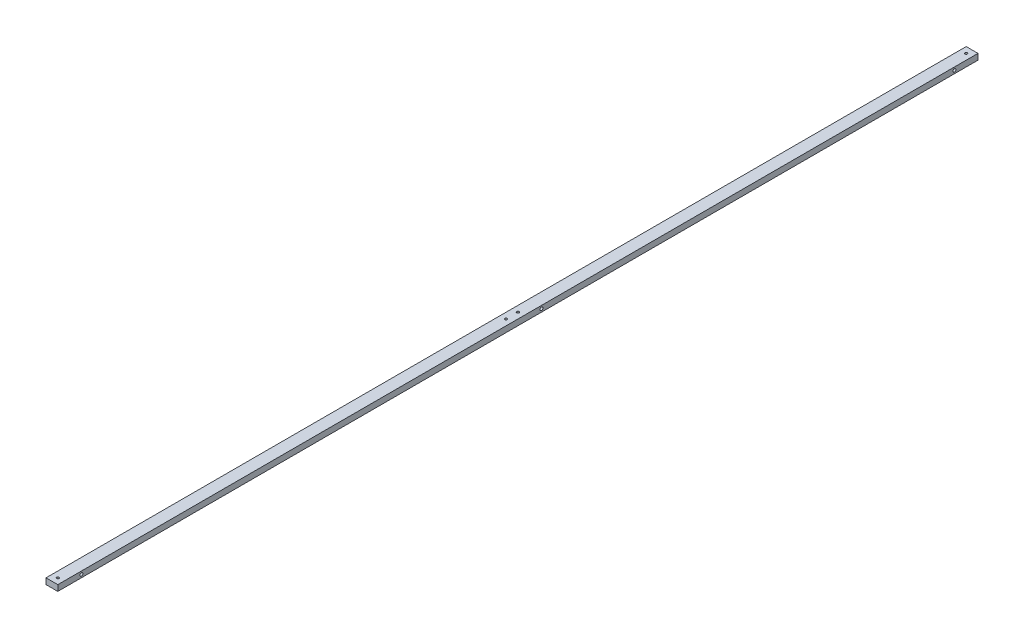
ISO-10303-21;
HEADER;
FILE_DESCRIPTION(('STEP AP214'),'2;1');
FILE_NAME('part.step','',(''),(''),'','','');
FILE_SCHEMA(('AUTOMOTIVE_DESIGN { 1 0 10303 214 1 1 1 1 }'));
ENDSEC;
DATA;
#1=APPLICATION_CONTEXT('core data for automotive mechanical design processes');
#2=APPLICATION_PROTOCOL_DEFINITION('international standard','automotive_design',2000,#1);
#3=PRODUCT_CONTEXT('',#1,'mechanical');
#4=PRODUCT('Part','Part','',(#3));
#5=PRODUCT_RELATED_PRODUCT_CATEGORY('part','',(#4));
#6=PRODUCT_DEFINITION_FORMATION('','',#4);
#7=PRODUCT_DEFINITION_CONTEXT('part definition',#1,'design');
#8=PRODUCT_DEFINITION('design','',#6,#7);
#9=PRODUCT_DEFINITION_SHAPE('','',#8);
#10=(LENGTH_UNIT() NAMED_UNIT(*) SI_UNIT(.MILLI.,.METRE.));
#11=(NAMED_UNIT(*) PLANE_ANGLE_UNIT() SI_UNIT($,.RADIAN.));
#12=(NAMED_UNIT(*) SI_UNIT($,.STERADIAN.) SOLID_ANGLE_UNIT());
#13=UNCERTAINTY_MEASURE_WITH_UNIT(LENGTH_MEASURE(1.E-05),#10,'distance_accuracy_value','');
#14=(GEOMETRIC_REPRESENTATION_CONTEXT(3) GLOBAL_UNCERTAINTY_ASSIGNED_CONTEXT((#13)) GLOBAL_UNIT_ASSIGNED_CONTEXT((#10,
#11,#12)) REPRESENTATION_CONTEXT('',''));
#15=CARTESIAN_POINT('',(0.,0.,0.));
#16=DIRECTION('',(0.,0.,1.));
#17=DIRECTION('',(1.,0.,0.));
#18=AXIS2_PLACEMENT_3D('',#15,#16,#17);
#19=CARTESIAN_POINT('',(0.,0.,1981.2));
#20=DIRECTION('',(1.,0.,0.));
#21=DIRECTION('',(0.,0.,-1.));
#22=AXIS2_PLACEMENT_3D('',#19,#20,#21);
#23=PLANE('',#22);
#24=CARTESIAN_POINT('',(0.,6.35,50.8));
#25=DIRECTION('',(1.,0.,0.));
#26=DIRECTION('',(0.,0.,-1.));
#27=AXIS2_PLACEMENT_3D('',#24,#25,#26);
#28=CIRCLE('',#27,3.175);
#29=CARTESIAN_POINT('',(0.,6.35,47.625));
#30=VERTEX_POINT('',#29);
#31=EDGE_CURVE('E148',#30,#30,#28,.T.);
#32=ORIENTED_EDGE('',*,*,#31,.T.);
#33=EDGE_LOOP('',(#32));
#34=FACE_BOUND('',#33,.T.);
#35=CARTESIAN_POINT('',(0.,6.35,939.8));
#36=DIRECTION('',(1.,0.,0.));
#37=DIRECTION('',(0.,0.,-1.));
#38=AXIS2_PLACEMENT_3D('',#35,#36,#37);
#39=CIRCLE('',#38,3.175);
#40=CARTESIAN_POINT('',(0.,6.35,936.625));
#41=VERTEX_POINT('',#40);
#42=EDGE_CURVE('E142',#41,#41,#39,.T.);
#43=ORIENTED_EDGE('',*,*,#42,.T.);
#44=EDGE_LOOP('',(#43));
#45=FACE_BOUND('',#44,.T.);
#46=CARTESIAN_POINT('',(0.,6.35,1930.4));
#47=DIRECTION('',(1.,0.,0.));
#48=DIRECTION('',(0.,0.,-1.));
#49=AXIS2_PLACEMENT_3D('',#46,#47,#48);
#50=CIRCLE('',#49,3.175);
#51=CARTESIAN_POINT('',(0.,6.35,1927.225));
#52=VERTEX_POINT('',#51);
#53=EDGE_CURVE('E136',#52,#52,#50,.T.);
#54=ORIENTED_EDGE('',*,*,#53,.T.);
#55=EDGE_LOOP('',(#54));
#56=FACE_BOUND('',#55,.T.);
#57=DIRECTION('',(0.,-1.,0.));
#58=VECTOR('',#57,1.);
#59=CARTESIAN_POINT('',(0.,0.,0.));
#60=LINE('',#59,#58);
#61=CARTESIAN_POINT('',(0.,12.7,0.));
#62=VERTEX_POINT('',#61);
#63=CARTESIAN_POINT('',(0.,0.,0.));
#64=VERTEX_POINT('',#63);
#65=EDGE_CURVE('E99',#62,#64,#60,.T.);
#66=ORIENTED_EDGE('',*,*,#65,.T.);
#67=DIRECTION('',(0.,0.,-1.));
#68=VECTOR('',#67,1.);
#69=CARTESIAN_POINT('',(0.,0.,1981.2));
#70=LINE('',#69,#68);
#71=CARTESIAN_POINT('',(0.,0.,1981.2));
#72=VERTEX_POINT('',#71);
#73=EDGE_CURVE('E11',#72,#64,#70,.T.);
#74=ORIENTED_EDGE('',*,*,#73,.F.);
#75=DIRECTION('',(0.,-1.,0.));
#76=VECTOR('',#75,1.);
#77=CARTESIAN_POINT('',(0.,0.,1981.2));
#78=LINE('',#77,#76);
#79=CARTESIAN_POINT('',(0.,12.7,1981.2));
#80=VERTEX_POINT('',#79);
#81=EDGE_CURVE('E87',#80,#72,#78,.T.);
#82=ORIENTED_EDGE('',*,*,#81,.F.);
#83=DIRECTION('',(0.,0.,-1.));
#84=VECTOR('',#83,1.);
#85=CARTESIAN_POINT('',(0.,12.7,1981.2));
#86=LINE('',#85,#84);
#87=EDGE_CURVE('E95',#80,#62,#86,.T.);
#88=ORIENTED_EDGE('',*,*,#87,.T.);
#89=EDGE_LOOP('',(#66,#74,#82,#88));
#90=FACE_BOUND('',#89,.T.);
#91=ADVANCED_FACE('F36',(#34,#45,#56,#90),#23,.F.);
#92=CARTESIAN_POINT('',(0.,0.,1981.2));
#93=DIRECTION('',(0.,1.,0.));
#94=DIRECTION('',(0.,0.,1.));
#95=AXIS2_PLACEMENT_3D('',#92,#93,#94);
#96=PLANE('',#95);
#97=CARTESIAN_POINT('',(12.7,0.,1968.5));
#98=DIRECTION('',(0.,1.,0.));
#99=DIRECTION('',(0.,0.,1.));
#100=AXIS2_PLACEMENT_3D('',#97,#98,#99);
#101=CIRCLE('',#100,2.5527);
#102=CARTESIAN_POINT('',(12.7,0.,1971.0527));
#103=VERTEX_POINT('',#102);
#104=EDGE_CURVE('E130',#103,#103,#101,.T.);
#105=ORIENTED_EDGE('',*,*,#104,.T.);
#106=EDGE_LOOP('',(#105));
#107=FACE_BOUND('',#106,.T.);
#108=CARTESIAN_POINT('',(12.7,0.,977.9));
#109=DIRECTION('',(0.,1.,0.));
#110=DIRECTION('',(0.,0.,1.));
#111=AXIS2_PLACEMENT_3D('',#108,#109,#110);
#112=CIRCLE('',#111,2.5527);
#113=CARTESIAN_POINT('',(12.7,0.,980.4527));
#114=VERTEX_POINT('',#113);
#115=EDGE_CURVE('E124',#114,#114,#112,.T.);
#116=ORIENTED_EDGE('',*,*,#115,.T.);
#117=EDGE_LOOP('',(#116));
#118=FACE_BOUND('',#117,.T.);
#119=CARTESIAN_POINT('',(12.7,0.,1003.3));
#120=DIRECTION('',(0.,1.,0.));
#121=DIRECTION('',(0.,0.,1.));
#122=AXIS2_PLACEMENT_3D('',#119,#120,#121);
#123=CIRCLE('',#122,2.5527);
#124=CARTESIAN_POINT('',(12.7,0.,1005.8527));
#125=VERTEX_POINT('',#124);
#126=EDGE_CURVE('E118',#125,#125,#123,.T.);
#127=ORIENTED_EDGE('',*,*,#126,.T.);
#128=EDGE_LOOP('',(#127));
#129=FACE_BOUND('',#128,.T.);
#130=CARTESIAN_POINT('',(12.7,0.,12.6999999999999));
#131=DIRECTION('',(0.,1.,0.));
#132=DIRECTION('',(0.,0.,1.));
#133=AXIS2_PLACEMENT_3D('',#130,#131,#132);
#134=CIRCLE('',#133,2.5527);
#135=CARTESIAN_POINT('',(12.7,0.,15.2526999999999));
#136=VERTEX_POINT('',#135);
#137=EDGE_CURVE('E102',#136,#136,#134,.T.);
#138=ORIENTED_EDGE('',*,*,#137,.T.);
#139=EDGE_LOOP('',(#138));
#140=FACE_BOUND('',#139,.T.);
#141=DIRECTION('',(1.,0.,0.));
#142=VECTOR('',#141,1.);
#143=CARTESIAN_POINT('',(0.,0.,0.));
#144=LINE('',#143,#142);
#145=CARTESIAN_POINT('',(25.4,0.,0.));
#146=VERTEX_POINT('',#145);
#147=EDGE_CURVE('E91',#64,#146,#144,.T.);
#148=ORIENTED_EDGE('',*,*,#147,.T.);
#149=DIRECTION('',(0.,0.,-1.));
#150=VECTOR('',#149,1.);
#151=CARTESIAN_POINT('',(25.4,0.,1981.2));
#152=LINE('',#151,#150);
#153=CARTESIAN_POINT('',(25.4,0.,1981.2));
#154=VERTEX_POINT('',#153);
#155=EDGE_CURVE('E44',#154,#146,#152,.T.);
#156=ORIENTED_EDGE('',*,*,#155,.F.);
#157=DIRECTION('',(1.,0.,0.));
#158=VECTOR('',#157,1.);
#159=CARTESIAN_POINT('',(0.,0.,1981.2));
#160=LINE('',#159,#158);
#161=EDGE_CURVE('E82',#72,#154,#160,.T.);
#162=ORIENTED_EDGE('',*,*,#161,.F.);
#163=ORIENTED_EDGE('',*,*,#73,.T.);
#164=EDGE_LOOP('',(#148,#156,#162,#163));
#165=FACE_BOUND('',#164,.T.);
#166=ADVANCED_FACE('F90',(#107,#118,#129,#140,#165),#96,.F.);
#167=CARTESIAN_POINT('',(25.4,0.,1981.2));
#168=DIRECTION('',(-1.,0.,0.));
#169=DIRECTION('',(0.,0.,1.));
#170=AXIS2_PLACEMENT_3D('',#167,#168,#169);
#171=PLANE('',#170);
#172=CARTESIAN_POINT('',(25.4,6.35,50.8));
#173=DIRECTION('',(1.,0.,0.));
#174=DIRECTION('',(0.,0.,-1.));
#175=AXIS2_PLACEMENT_3D('',#172,#173,#174);
#176=CIRCLE('',#175,3.175);
#177=CARTESIAN_POINT('',(25.4,6.35,47.625));
#178=VERTEX_POINT('',#177);
#179=EDGE_CURVE('E151',#178,#178,#176,.T.);
#180=ORIENTED_EDGE('',*,*,#179,.F.);
#181=EDGE_LOOP('',(#180));
#182=FACE_BOUND('',#181,.T.);
#183=CARTESIAN_POINT('',(25.4,6.35,939.8));
#184=DIRECTION('',(1.,0.,0.));
#185=DIRECTION('',(0.,0.,-1.));
#186=AXIS2_PLACEMENT_3D('',#183,#184,#185);
#187=CIRCLE('',#186,3.175);
#188=CARTESIAN_POINT('',(25.4,6.35,936.625));
#189=VERTEX_POINT('',#188);
#190=EDGE_CURVE('E145',#189,#189,#187,.T.);
#191=ORIENTED_EDGE('',*,*,#190,.F.);
#192=EDGE_LOOP('',(#191));
#193=FACE_BOUND('',#192,.T.);
#194=CARTESIAN_POINT('',(25.4,6.35,1930.4));
#195=DIRECTION('',(1.,0.,0.));
#196=DIRECTION('',(0.,0.,-1.));
#197=AXIS2_PLACEMENT_3D('',#194,#195,#196);
#198=CIRCLE('',#197,3.175);
#199=CARTESIAN_POINT('',(25.4,6.35,1927.225));
#200=VERTEX_POINT('',#199);
#201=EDGE_CURVE('E139',#200,#200,#198,.T.);
#202=ORIENTED_EDGE('',*,*,#201,.F.);
#203=EDGE_LOOP('',(#202));
#204=FACE_BOUND('',#203,.T.);
#205=DIRECTION('',(0.,1.,0.));
#206=VECTOR('',#205,1.);
#207=CARTESIAN_POINT('',(25.4,0.,0.));
#208=LINE('',#207,#206);
#209=CARTESIAN_POINT('',(25.4,12.7,0.));
#210=VERTEX_POINT('',#209);
#211=EDGE_CURVE('E69',#146,#210,#208,.T.);
#212=ORIENTED_EDGE('',*,*,#211,.T.);
#213=DIRECTION('',(0.,0.,-1.));
#214=VECTOR('',#213,1.);
#215=CARTESIAN_POINT('',(25.4,12.7,1981.2));
#216=LINE('',#215,#214);
#217=CARTESIAN_POINT('',(25.4,12.7,1981.2));
#218=VERTEX_POINT('',#217);
#219=EDGE_CURVE('E92',#218,#210,#216,.T.);
#220=ORIENTED_EDGE('',*,*,#219,.F.);
#221=DIRECTION('',(0.,1.,0.));
#222=VECTOR('',#221,1.);
#223=CARTESIAN_POINT('',(25.4,0.,1981.2));
#224=LINE('',#223,#222);
#225=EDGE_CURVE('E85',#154,#218,#224,.T.);
#226=ORIENTED_EDGE('',*,*,#225,.F.);
#227=ORIENTED_EDGE('',*,*,#155,.T.);
#228=EDGE_LOOP('',(#212,#220,#226,#227));
#229=FACE_BOUND('',#228,.T.);
#230=ADVANCED_FACE('F93',(#182,#193,#204,#229),#171,.F.);
#231=CARTESIAN_POINT('',(0.,12.7,1981.2));
#232=DIRECTION('',(0.,-1.,0.));
#233=DIRECTION('',(0.,0.,-1.));
#234=AXIS2_PLACEMENT_3D('',#231,#232,#233);
#235=PLANE('',#234);
#236=CARTESIAN_POINT('',(12.7,12.7,1968.5));
#237=DIRECTION('',(0.,1.,0.));
#238=DIRECTION('',(0.,0.,1.));
#239=AXIS2_PLACEMENT_3D('',#236,#237,#238);
#240=CIRCLE('',#239,2.5527);
#241=CARTESIAN_POINT('',(12.7,12.7,1971.0527));
#242=VERTEX_POINT('',#241);
#243=EDGE_CURVE('E133',#242,#242,#240,.T.);
#244=ORIENTED_EDGE('',*,*,#243,.F.);
#245=EDGE_LOOP('',(#244));
#246=FACE_BOUND('',#245,.T.);
#247=CARTESIAN_POINT('',(12.7,12.7,977.9));
#248=DIRECTION('',(0.,1.,0.));
#249=DIRECTION('',(0.,0.,1.));
#250=AXIS2_PLACEMENT_3D('',#247,#248,#249);
#251=CIRCLE('',#250,2.5527);
#252=CARTESIAN_POINT('',(12.7,12.7,980.4527));
#253=VERTEX_POINT('',#252);
#254=EDGE_CURVE('E127',#253,#253,#251,.T.);
#255=ORIENTED_EDGE('',*,*,#254,.F.);
#256=EDGE_LOOP('',(#255));
#257=FACE_BOUND('',#256,.T.);
#258=CARTESIAN_POINT('',(12.7,12.7,1003.3));
#259=DIRECTION('',(0.,1.,0.));
#260=DIRECTION('',(0.,0.,1.));
#261=AXIS2_PLACEMENT_3D('',#258,#259,#260);
#262=CIRCLE('',#261,2.5527);
#263=CARTESIAN_POINT('',(12.7,12.7,1005.8527));
#264=VERTEX_POINT('',#263);
#265=EDGE_CURVE('E121',#264,#264,#262,.T.);
#266=ORIENTED_EDGE('',*,*,#265,.F.);
#267=EDGE_LOOP('',(#266));
#268=FACE_BOUND('',#267,.T.);
#269=CARTESIAN_POINT('',(12.7,12.7,12.6999999999999));
#270=DIRECTION('',(0.,1.,0.));
#271=DIRECTION('',(0.,0.,1.));
#272=AXIS2_PLACEMENT_3D('',#269,#270,#271);
#273=CIRCLE('',#272,2.5527);
#274=CARTESIAN_POINT('',(12.7,12.7,15.2526999999999));
#275=VERTEX_POINT('',#274);
#276=EDGE_CURVE('E115',#275,#275,#273,.T.);
#277=ORIENTED_EDGE('',*,*,#276,.F.);
#278=EDGE_LOOP('',(#277));
#279=FACE_BOUND('',#278,.T.);
#280=DIRECTION('',(-1.,0.,0.));
#281=VECTOR('',#280,1.);
#282=CARTESIAN_POINT('',(0.,12.7,0.));
#283=LINE('',#282,#281);
#284=EDGE_CURVE('E75',#210,#62,#283,.T.);
#285=ORIENTED_EDGE('',*,*,#284,.T.);
#286=ORIENTED_EDGE('',*,*,#87,.F.);
#287=DIRECTION('',(-1.,0.,0.));
#288=VECTOR('',#287,1.);
#289=CARTESIAN_POINT('',(0.,12.7,1981.2));
#290=LINE('',#289,#288);
#291=EDGE_CURVE('E52',#218,#80,#290,.T.);
#292=ORIENTED_EDGE('',*,*,#291,.F.);
#293=ORIENTED_EDGE('',*,*,#219,.T.);
#294=EDGE_LOOP('',(#285,#286,#292,#293));
#295=FACE_BOUND('',#294,.T.);
#296=ADVANCED_FACE('F107',(#246,#257,#268,#279,#295),#235,.F.);
#297=CARTESIAN_POINT('',(0.,0.,1981.2));
#298=DIRECTION('',(0.,0.,-1.));
#299=DIRECTION('',(-1.,0.,0.));
#300=AXIS2_PLACEMENT_3D('',#297,#298,#299);
#301=PLANE('',#300);
#302=ORIENTED_EDGE('',*,*,#81,.T.);
#303=ORIENTED_EDGE('',*,*,#161,.T.);
#304=ORIENTED_EDGE('',*,*,#225,.T.);
#305=ORIENTED_EDGE('',*,*,#291,.T.);
#306=EDGE_LOOP('',(#302,#303,#304,#305));
#307=FACE_BOUND('',#306,.T.);
#308=ADVANCED_FACE('F83',(#307),#301,.F.);
#309=CARTESIAN_POINT('',(0.,0.,0.));
#310=DIRECTION('',(0.,0.,-1.));
#311=DIRECTION('',(-1.,0.,0.));
#312=AXIS2_PLACEMENT_3D('',#309,#310,#311);
#313=PLANE('',#312);
#314=ORIENTED_EDGE('',*,*,#65,.F.);
#315=ORIENTED_EDGE('',*,*,#284,.F.);
#316=ORIENTED_EDGE('',*,*,#211,.F.);
#317=ORIENTED_EDGE('',*,*,#147,.F.);
#318=EDGE_LOOP('',(#314,#315,#316,#317));
#319=FACE_BOUND('',#318,.T.);
#320=ADVANCED_FACE('F110',(#319),#313,.T.);
#321=CARTESIAN_POINT('',(12.7,12.7,12.6999999999999));
#322=DIRECTION('',(0.,1.,0.));
#323=DIRECTION('',(0.,0.,1.));
#324=AXIS2_PLACEMENT_3D('',#321,#322,#323);
#325=CYLINDRICAL_SURFACE('',#324,2.5527);
#326=ORIENTED_EDGE('',*,*,#137,.F.);
#327=EDGE_LOOP('',(#326));
#328=FACE_BOUND('',#327,.T.);
#329=ORIENTED_EDGE('',*,*,#276,.T.);
#330=EDGE_LOOP('',(#329));
#331=FACE_BOUND('',#330,.T.);
#332=ADVANCED_FACE('F242',(#328,#331),#325,.F.);
#333=CARTESIAN_POINT('',(12.7,12.7,1003.3));
#334=DIRECTION('',(0.,1.,0.));
#335=DIRECTION('',(0.,0.,1.));
#336=AXIS2_PLACEMENT_3D('',#333,#334,#335);
#337=CYLINDRICAL_SURFACE('',#336,2.5527);
#338=ORIENTED_EDGE('',*,*,#126,.F.);
#339=EDGE_LOOP('',(#338));
#340=FACE_BOUND('',#339,.T.);
#341=ORIENTED_EDGE('',*,*,#265,.T.);
#342=EDGE_LOOP('',(#341));
#343=FACE_BOUND('',#342,.T.);
#344=ADVANCED_FACE('F232',(#340,#343),#337,.F.);
#345=CARTESIAN_POINT('',(12.7,12.7,977.9));
#346=DIRECTION('',(0.,1.,0.));
#347=DIRECTION('',(0.,0.,1.));
#348=AXIS2_PLACEMENT_3D('',#345,#346,#347);
#349=CYLINDRICAL_SURFACE('',#348,2.5527);
#350=ORIENTED_EDGE('',*,*,#115,.F.);
#351=EDGE_LOOP('',(#350));
#352=FACE_BOUND('',#351,.T.);
#353=ORIENTED_EDGE('',*,*,#254,.T.);
#354=EDGE_LOOP('',(#353));
#355=FACE_BOUND('',#354,.T.);
#356=ADVANCED_FACE('F176',(#352,#355),#349,.F.);
#357=CARTESIAN_POINT('',(12.7,12.7,1968.5));
#358=DIRECTION('',(0.,1.,0.));
#359=DIRECTION('',(0.,0.,1.));
#360=AXIS2_PLACEMENT_3D('',#357,#358,#359);
#361=CYLINDRICAL_SURFACE('',#360,2.5527);
#362=ORIENTED_EDGE('',*,*,#104,.F.);
#363=EDGE_LOOP('',(#362));
#364=FACE_BOUND('',#363,.T.);
#365=ORIENTED_EDGE('',*,*,#243,.T.);
#366=EDGE_LOOP('',(#365));
#367=FACE_BOUND('',#366,.T.);
#368=ADVANCED_FACE('F167',(#364,#367),#361,.F.);
#369=CARTESIAN_POINT('',(25.4,6.35,1930.4));
#370=DIRECTION('',(1.,0.,0.));
#371=DIRECTION('',(0.,0.,-1.));
#372=AXIS2_PLACEMENT_3D('',#369,#370,#371);
#373=CYLINDRICAL_SURFACE('',#372,3.175);
#374=ORIENTED_EDGE('',*,*,#53,.F.);
#375=EDGE_LOOP('',(#374));
#376=FACE_BOUND('',#375,.T.);
#377=ORIENTED_EDGE('',*,*,#201,.T.);
#378=EDGE_LOOP('',(#377));
#379=FACE_BOUND('',#378,.T.);
#380=ADVANCED_FACE('F164',(#376,#379),#373,.F.);
#381=CARTESIAN_POINT('',(25.4,6.35,939.8));
#382=DIRECTION('',(1.,0.,0.));
#383=DIRECTION('',(0.,0.,-1.));
#384=AXIS2_PLACEMENT_3D('',#381,#382,#383);
#385=CYLINDRICAL_SURFACE('',#384,3.175);
#386=ORIENTED_EDGE('',*,*,#42,.F.);
#387=EDGE_LOOP('',(#386));
#388=FACE_BOUND('',#387,.T.);
#389=ORIENTED_EDGE('',*,*,#190,.T.);
#390=EDGE_LOOP('',(#389));
#391=FACE_BOUND('',#390,.T.);
#392=ADVANCED_FACE('F166',(#388,#391),#385,.F.);
#393=CARTESIAN_POINT('',(25.4,6.35,50.8));
#394=DIRECTION('',(1.,0.,0.));
#395=DIRECTION('',(0.,0.,-1.));
#396=AXIS2_PLACEMENT_3D('',#393,#394,#395);
#397=CYLINDRICAL_SURFACE('',#396,3.175);
#398=ORIENTED_EDGE('',*,*,#31,.F.);
#399=EDGE_LOOP('',(#398));
#400=FACE_BOUND('',#399,.T.);
#401=ORIENTED_EDGE('',*,*,#179,.T.);
#402=EDGE_LOOP('',(#401));
#403=FACE_BOUND('',#402,.T.);
#404=ADVANCED_FACE('F155',(#400,#403),#397,.F.);
#405=CLOSED_SHELL('',(#91,#166,#230,#296,#308,#320,#332,#344,#356,#368,#380,#392,#404));
#406=MANIFOLD_SOLID_BREP('B2',#405);
#407=ADVANCED_BREP_SHAPE_REPRESENTATION('',(#18,#406),#14);
#408=SHAPE_DEFINITION_REPRESENTATION(#9,#407);
ENDSEC;
END-ISO-10303-21;
